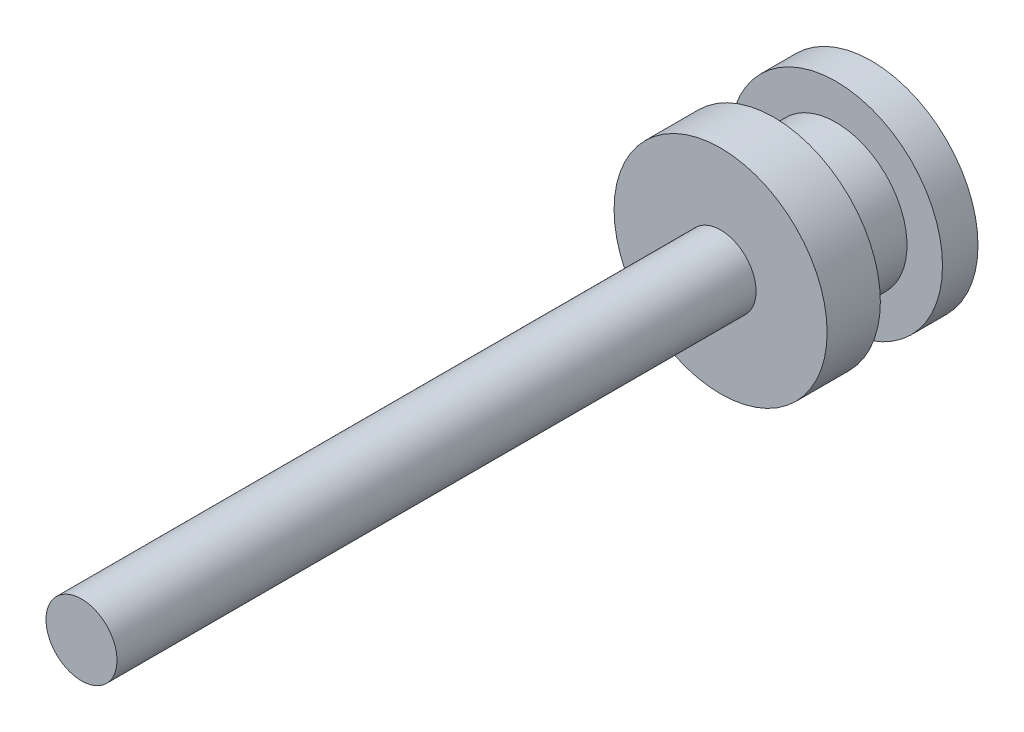
ISO-10303-21;
HEADER;
FILE_DESCRIPTION(('STEP AP214'),'2;1');
FILE_NAME('part.step','',(''),(''),'','','');
FILE_SCHEMA(('AUTOMOTIVE_DESIGN { 1 0 10303 214 1 1 1 1 }'));
ENDSEC;
DATA;
#1=APPLICATION_CONTEXT('core data for automotive mechanical design processes');
#2=APPLICATION_PROTOCOL_DEFINITION('international standard','automotive_design',2000,#1);
#3=PRODUCT_CONTEXT('',#1,'mechanical');
#4=PRODUCT('Part','Part','',(#3));
#5=PRODUCT_RELATED_PRODUCT_CATEGORY('part','',(#4));
#6=PRODUCT_DEFINITION_FORMATION('','',#4);
#7=PRODUCT_DEFINITION_CONTEXT('part definition',#1,'design');
#8=PRODUCT_DEFINITION('design','',#6,#7);
#9=PRODUCT_DEFINITION_SHAPE('','',#8);
#10=(LENGTH_UNIT() NAMED_UNIT(*) SI_UNIT(.MILLI.,.METRE.));
#11=(NAMED_UNIT(*) PLANE_ANGLE_UNIT() SI_UNIT($,.RADIAN.));
#12=(NAMED_UNIT(*) SI_UNIT($,.STERADIAN.) SOLID_ANGLE_UNIT());
#13=UNCERTAINTY_MEASURE_WITH_UNIT(LENGTH_MEASURE(1.E-05),#10,'distance_accuracy_value','');
#14=(GEOMETRIC_REPRESENTATION_CONTEXT(3) GLOBAL_UNCERTAINTY_ASSIGNED_CONTEXT((#13)) GLOBAL_UNIT_ASSIGNED_CONTEXT((#10,
#11,#12)) REPRESENTATION_CONTEXT('',''));
#15=CARTESIAN_POINT('',(0.,0.,0.));
#16=DIRECTION('',(0.,0.,1.));
#17=DIRECTION('',(1.,0.,0.));
#18=AXIS2_PLACEMENT_3D('',#15,#16,#17);
#19=CARTESIAN_POINT('',(0.,0.,30.));
#20=DIRECTION('',(0.,0.,-1.));
#21=DIRECTION('',(-1.,0.,0.));
#22=AXIS2_PLACEMENT_3D('',#19,#20,#21);
#23=CYLINDRICAL_SURFACE('',#22,60.);
#24=CARTESIAN_POINT('',(0.,0.,30.));
#25=DIRECTION('',(0.,0.,1.));
#26=DIRECTION('',(1.,0.,0.));
#27=AXIS2_PLACEMENT_3D('',#24,#25,#26);
#28=CIRCLE('',#27,60.);
#29=CARTESIAN_POINT('',(60.,0.,30.));
#30=VERTEX_POINT('',#29);
#31=EDGE_CURVE('E44',#30,#30,#28,.T.);
#32=ORIENTED_EDGE('',*,*,#31,.F.);
#33=EDGE_LOOP('',(#32));
#34=FACE_BOUND('',#33,.T.);
#35=CARTESIAN_POINT('',(0.,0.,0.));
#36=DIRECTION('',(0.,0.,1.));
#37=DIRECTION('',(1.,0.,0.));
#38=AXIS2_PLACEMENT_3D('',#35,#36,#37);
#39=CIRCLE('',#38,60.);
#40=CARTESIAN_POINT('',(60.,0.,0.));
#41=VERTEX_POINT('',#40);
#42=EDGE_CURVE('E35',#41,#41,#39,.T.);
#43=ORIENTED_EDGE('',*,*,#42,.T.);
#44=EDGE_LOOP('',(#43));
#45=FACE_BOUND('',#44,.T.);
#46=ADVANCED_FACE('F32',(#34,#45),#23,.T.);
#47=CARTESIAN_POINT('',(0.,0.,30.));
#48=DIRECTION('',(0.,0.,1.));
#49=DIRECTION('',(1.,0.,0.));
#50=AXIS2_PLACEMENT_3D('',#47,#48,#49);
#51=PLANE('',#50);
#52=CARTESIAN_POINT('',(0.,0.,30.));
#53=DIRECTION('',(0.,0.,1.));
#54=DIRECTION('',(1.,0.,0.));
#55=AXIS2_PLACEMENT_3D('',#52,#53,#54);
#56=CIRCLE('',#55,20.);
#57=CARTESIAN_POINT('',(-20.,0.,30.));
#58=VERTEX_POINT('',#57);
#59=EDGE_CURVE('E39',#58,#58,#56,.T.);
#60=ORIENTED_EDGE('',*,*,#59,.F.);
#61=EDGE_LOOP('',(#60));
#62=FACE_BOUND('',#61,.T.);
#63=ORIENTED_EDGE('',*,*,#31,.T.);
#64=EDGE_LOOP('',(#63));
#65=FACE_BOUND('',#64,.T.);
#66=ADVANCED_FACE('F62',(#62,#65),#51,.T.);
#67=CARTESIAN_POINT('',(0.,0.,0.));
#68=DIRECTION('',(0.,0.,1.));
#69=DIRECTION('',(1.,0.,0.));
#70=AXIS2_PLACEMENT_3D('',#67,#68,#69);
#71=PLANE('',#70);
#72=CARTESIAN_POINT('',(0.,0.,0.));
#73=DIRECTION('',(0.,0.,-1.));
#74=DIRECTION('',(-1.,0.,0.));
#75=AXIS2_PLACEMENT_3D('',#72,#73,#74);
#76=CIRCLE('',#75,40.);
#77=CARTESIAN_POINT('',(-40.,0.,0.));
#78=VERTEX_POINT('',#77);
#79=EDGE_CURVE('E10',#78,#78,#76,.T.);
#80=ORIENTED_EDGE('',*,*,#79,.F.);
#81=EDGE_LOOP('',(#80));
#82=FACE_BOUND('',#81,.T.);
#83=ORIENTED_EDGE('',*,*,#42,.F.);
#84=EDGE_LOOP('',(#83));
#85=FACE_BOUND('',#84,.T.);
#86=ADVANCED_FACE('F59',(#82,#85),#71,.F.);
#87=CARTESIAN_POINT('',(0.,0.,390.));
#88=DIRECTION('',(0.,0.,-1.));
#89=DIRECTION('',(-1.,0.,0.));
#90=AXIS2_PLACEMENT_3D('',#87,#88,#89);
#91=CYLINDRICAL_SURFACE('',#90,20.);
#92=CARTESIAN_POINT('',(0.,0.,390.));
#93=DIRECTION('',(0.,0.,1.));
#94=DIRECTION('',(1.,0.,0.));
#95=AXIS2_PLACEMENT_3D('',#92,#93,#94);
#96=CIRCLE('',#95,20.);
#97=CARTESIAN_POINT('',(-20.,0.,390.));
#98=VERTEX_POINT('',#97);
#99=EDGE_CURVE('E50',#98,#98,#96,.T.);
#100=CARTESIAN_POINT('',(-20.,0.,390.));
#101=CARTESIAN_POINT('',(-20.,0.,386.25));
#102=CARTESIAN_POINT('',(-20.,0.,382.5));
#103=CARTESIAN_POINT('',(-20.,0.,375.));
#104=CARTESIAN_POINT('',(-20.,0.,371.25));
#105=CARTESIAN_POINT('',(-20.,0.,363.75));
#106=CARTESIAN_POINT('',(-20.,0.,360.));
#107=CARTESIAN_POINT('',(-20.,0.,352.5));
#108=CARTESIAN_POINT('',(-20.,0.,348.75));
#109=CARTESIAN_POINT('',(-20.,0.,341.25));
#110=CARTESIAN_POINT('',(-20.,0.,337.5));
#111=CARTESIAN_POINT('',(-20.,0.,330.));
#112=CARTESIAN_POINT('',(-20.,0.,326.25));
#113=CARTESIAN_POINT('',(-20.,0.,318.75));
#114=CARTESIAN_POINT('',(-20.,0.,315.));
#115=CARTESIAN_POINT('',(-20.,0.,307.5));
#116=CARTESIAN_POINT('',(-20.,0.,303.75));
#117=CARTESIAN_POINT('',(-20.,0.,296.25));
#118=CARTESIAN_POINT('',(-20.,0.,292.5));
#119=CARTESIAN_POINT('',(-20.,0.,285.));
#120=CARTESIAN_POINT('',(-20.,0.,281.25));
#121=CARTESIAN_POINT('',(-20.,0.,273.75));
#122=CARTESIAN_POINT('',(-20.,0.,270.));
#123=CARTESIAN_POINT('',(-20.,0.,262.5));
#124=CARTESIAN_POINT('',(-20.,0.,258.75));
#125=CARTESIAN_POINT('',(-20.,0.,251.25));
#126=CARTESIAN_POINT('',(-20.,0.,247.5));
#127=CARTESIAN_POINT('',(-20.,0.,240.));
#128=CARTESIAN_POINT('',(-20.,0.,236.25));
#129=CARTESIAN_POINT('',(-20.,0.,228.75));
#130=CARTESIAN_POINT('',(-20.,0.,225.));
#131=CARTESIAN_POINT('',(-20.,0.,217.5));
#132=CARTESIAN_POINT('',(-20.,0.,213.75));
#133=CARTESIAN_POINT('',(-20.,0.,206.25));
#134=CARTESIAN_POINT('',(-20.,0.,202.5));
#135=CARTESIAN_POINT('',(-20.,0.,195.));
#136=CARTESIAN_POINT('',(-20.,0.,191.25));
#137=CARTESIAN_POINT('',(-20.,0.,183.75));
#138=CARTESIAN_POINT('',(-20.,0.,180.));
#139=CARTESIAN_POINT('',(-20.,0.,172.5));
#140=CARTESIAN_POINT('',(-20.,0.,168.75));
#141=CARTESIAN_POINT('',(-20.,0.,161.25));
#142=CARTESIAN_POINT('',(-20.,0.,157.5));
#143=CARTESIAN_POINT('',(-20.,0.,150.));
#144=CARTESIAN_POINT('',(-20.,0.,146.25));
#145=CARTESIAN_POINT('',(-20.,0.,138.75));
#146=CARTESIAN_POINT('',(-20.,0.,135.));
#147=CARTESIAN_POINT('',(-20.,0.,127.5));
#148=CARTESIAN_POINT('',(-20.,0.,123.75));
#149=CARTESIAN_POINT('',(-20.,0.,116.25));
#150=CARTESIAN_POINT('',(-20.,0.,112.5));
#151=CARTESIAN_POINT('',(-20.,0.,105.));
#152=CARTESIAN_POINT('',(-20.,0.,101.25));
#153=CARTESIAN_POINT('',(-20.,0.,93.75));
#154=CARTESIAN_POINT('',(-20.,0.,90.));
#155=CARTESIAN_POINT('',(-20.,0.,82.5));
#156=CARTESIAN_POINT('',(-20.,0.,78.75));
#157=CARTESIAN_POINT('',(-20.,0.,71.25));
#158=CARTESIAN_POINT('',(-20.,0.,67.5));
#159=CARTESIAN_POINT('',(-20.,0.,60.));
#160=CARTESIAN_POINT('',(-20.,0.,56.25));
#161=CARTESIAN_POINT('',(-20.,0.,48.75));
#162=CARTESIAN_POINT('',(-20.,0.,45.));
#163=CARTESIAN_POINT('',(-20.,0.,37.5));
#164=CARTESIAN_POINT('',(-20.,0.,33.75));
#165=CARTESIAN_POINT('',(-20.,0.,30.));
#166=B_SPLINE_CURVE_WITH_KNOTS('',3,(#100,#101,#102,#103,#104,#105,#106,#107,#108,#109,#110,
#111,#112,#113,#114,#115,#116,#117,#118,#119,#120,#121,#122,#123,#124,#125,#126,#127,#128,#129,
#130,#131,#132,#133,#134,#135,#136,#137,#138,#139,#140,#141,#142,#143,#144,#145,#146,#147,#148,
#149,#150,#151,#152,#153,#154,#155,#156,#157,#158,#159,#160,#161,#162,#163,#164,#165),
.UNSPECIFIED.,.F.,.F.,(4,2,2,2,2,2,2,2,2,2,2,2,2,2,2,2,2,2,2,2,2,2,2,2,2,2,2,2,2,2,2,2,4),(0.,
11.25,22.5,33.7499999999999,45.,56.25,67.4999999999999,78.75,90.,101.25,112.5,123.75,135.,
146.25,157.5,168.75,180.,191.25,202.5,213.75,225.,236.25,247.5,258.75,270.,281.25,292.5,303.75,
315.,326.25,337.5,348.75,360.),.UNSPECIFIED.);
#167=EDGE_CURVE('BSEAM61',#98,#58,#166,.T.);
#168=ORIENTED_EDGE('',*,*,#99,.F.);
#169=ORIENTED_EDGE('',*,*,#59,.T.);
#170=ORIENTED_EDGE('',*,*,#167,.T.);
#171=ORIENTED_EDGE('',*,*,#167,.F.);
#172=EDGE_LOOP('',(#168,#170,#169,#171));
#173=FACE_BOUND('',#172,.T.);
#174=ADVANCED_FACE('F61',(#173),#91,.T.);
#175=CARTESIAN_POINT('',(0.,0.,390.));
#176=DIRECTION('',(0.,0.,1.));
#177=DIRECTION('',(1.,0.,0.));
#178=AXIS2_PLACEMENT_3D('',#175,#176,#177);
#179=PLANE('',#178);
#180=ORIENTED_EDGE('',*,*,#99,.T.);
#181=EDGE_LOOP('',(#180));
#182=FACE_BOUND('',#181,.T.);
#183=ADVANCED_FACE('F68',(#182),#179,.T.);
#184=CARTESIAN_POINT('',(0.,0.,-35.));
#185=DIRECTION('',(0.,0.,1.));
#186=DIRECTION('',(1.,0.,0.));
#187=AXIS2_PLACEMENT_3D('',#184,#185,#186);
#188=CYLINDRICAL_SURFACE('',#187,40.);
#189=CARTESIAN_POINT('',(0.,0.,-35.));
#190=DIRECTION('',(0.,0.,-1.));
#191=DIRECTION('',(-1.,0.,0.));
#192=AXIS2_PLACEMENT_3D('',#189,#190,#191);
#193=CIRCLE('',#192,40.);
#194=CARTESIAN_POINT('',(-40.,0.,-35.));
#195=VERTEX_POINT('',#194);
#196=EDGE_CURVE('E48',#195,#195,#193,.T.);
#197=ORIENTED_EDGE('',*,*,#196,.F.);
#198=EDGE_LOOP('',(#197));
#199=FACE_BOUND('',#198,.T.);
#200=ORIENTED_EDGE('',*,*,#79,.T.);
#201=EDGE_LOOP('',(#200));
#202=FACE_BOUND('',#201,.T.);
#203=ADVANCED_FACE('F96',(#199,#202),#188,.T.);
#204=CARTESIAN_POINT('',(0.,0.,-55.));
#205=DIRECTION('',(0.,0.,1.));
#206=DIRECTION('',(1.,0.,0.));
#207=AXIS2_PLACEMENT_3D('',#204,#205,#206);
#208=CYLINDRICAL_SURFACE('',#207,60.);
#209=CARTESIAN_POINT('',(0.,0.,-55.));
#210=DIRECTION('',(0.,0.,-1.));
#211=DIRECTION('',(-1.,0.,0.));
#212=AXIS2_PLACEMENT_3D('',#209,#210,#211);
#213=CIRCLE('',#212,60.);
#214=CARTESIAN_POINT('',(-60.,0.,-55.));
#215=VERTEX_POINT('',#214);
#216=EDGE_CURVE('E151',#215,#215,#213,.T.);
#217=ORIENTED_EDGE('',*,*,#216,.F.);
#218=EDGE_LOOP('',(#217));
#219=FACE_BOUND('',#218,.T.);
#220=CARTESIAN_POINT('',(0.,0.,-35.));
#221=DIRECTION('',(0.,0.,-1.));
#222=DIRECTION('',(-1.,0.,0.));
#223=AXIS2_PLACEMENT_3D('',#220,#221,#222);
#224=CIRCLE('',#223,60.);
#225=CARTESIAN_POINT('',(-60.,0.,-35.));
#226=VERTEX_POINT('',#225);
#227=EDGE_CURVE('E149',#226,#226,#224,.T.);
#228=ORIENTED_EDGE('',*,*,#227,.T.);
#229=EDGE_LOOP('',(#228));
#230=FACE_BOUND('',#229,.T.);
#231=ADVANCED_FACE('F110',(#219,#230),#208,.T.);
#232=CARTESIAN_POINT('',(0.,0.,-55.));
#233=DIRECTION('',(0.,0.,-1.));
#234=DIRECTION('',(-1.,0.,0.));
#235=AXIS2_PLACEMENT_3D('',#232,#233,#234);
#236=PLANE('',#235);
#237=ORIENTED_EDGE('',*,*,#216,.T.);
#238=EDGE_LOOP('',(#237));
#239=FACE_BOUND('',#238,.T.);
#240=ADVANCED_FACE('F120',(#239),#236,.T.);
#241=CARTESIAN_POINT('',(0.,0.,-35.));
#242=DIRECTION('',(0.,0.,-1.));
#243=DIRECTION('',(-1.,0.,0.));
#244=AXIS2_PLACEMENT_3D('',#241,#242,#243);
#245=PLANE('',#244);
#246=ORIENTED_EDGE('',*,*,#196,.T.);
#247=EDGE_LOOP('',(#246));
#248=FACE_BOUND('',#247,.T.);
#249=ORIENTED_EDGE('',*,*,#227,.F.);
#250=EDGE_LOOP('',(#249));
#251=FACE_BOUND('',#250,.T.);
#252=ADVANCED_FACE('F130',(#248,#251),#245,.F.);
#253=CLOSED_SHELL('',(#46,#66,#86,#174,#183,#203,#231,#240,#252));
#254=MANIFOLD_SOLID_BREP('B2',#253);
#255=ADVANCED_BREP_SHAPE_REPRESENTATION('',(#18,#254),#14);
#256=SHAPE_DEFINITION_REPRESENTATION(#9,#255);
ENDSEC;
END-ISO-10303-21;
